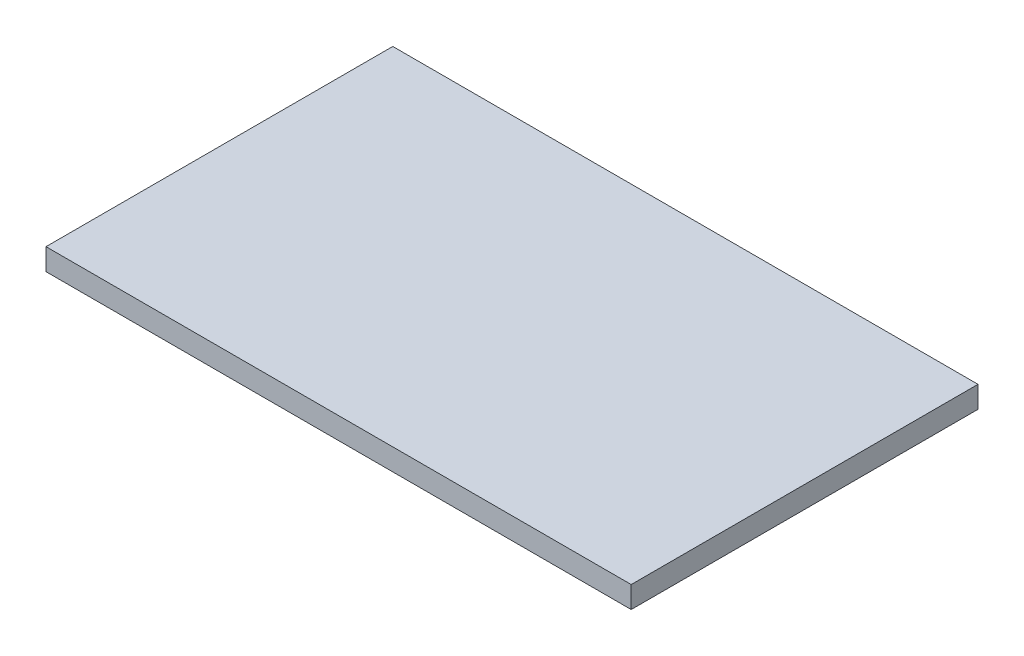
ISO-10303-21;
HEADER;
FILE_DESCRIPTION(('STEP AP214'),'2;1');
FILE_NAME('part.step','',(''),(''),'','','');
FILE_SCHEMA(('AUTOMOTIVE_DESIGN { 1 0 10303 214 1 1 1 1 }'));
ENDSEC;
DATA;
#1=APPLICATION_CONTEXT('core data for automotive mechanical design processes');
#2=APPLICATION_PROTOCOL_DEFINITION('international standard','automotive_design',2000,#1);
#3=PRODUCT_CONTEXT('',#1,'mechanical');
#4=PRODUCT('Part','Part','',(#3));
#5=PRODUCT_RELATED_PRODUCT_CATEGORY('part','',(#4));
#6=PRODUCT_DEFINITION_FORMATION('','',#4);
#7=PRODUCT_DEFINITION_CONTEXT('part definition',#1,'design');
#8=PRODUCT_DEFINITION('design','',#6,#7);
#9=PRODUCT_DEFINITION_SHAPE('','',#8);
#10=(LENGTH_UNIT() NAMED_UNIT(*) SI_UNIT(.MILLI.,.METRE.));
#11=(NAMED_UNIT(*) PLANE_ANGLE_UNIT() SI_UNIT($,.RADIAN.));
#12=(NAMED_UNIT(*) SI_UNIT($,.STERADIAN.) SOLID_ANGLE_UNIT());
#13=UNCERTAINTY_MEASURE_WITH_UNIT(LENGTH_MEASURE(1.E-05),#10,'distance_accuracy_value','');
#14=(GEOMETRIC_REPRESENTATION_CONTEXT(3) GLOBAL_UNCERTAINTY_ASSIGNED_CONTEXT((#13)) GLOBAL_UNIT_ASSIGNED_CONTEXT((#10,
#11,#12)) REPRESENTATION_CONTEXT('',''));
#15=CARTESIAN_POINT('',(0.,0.,0.));
#16=DIRECTION('',(0.,0.,1.));
#17=DIRECTION('',(1.,0.,0.));
#18=AXIS2_PLACEMENT_3D('',#15,#16,#17);
#19=CARTESIAN_POINT('',(135.,-5.,160.));
#20=DIRECTION('',(-1.,0.,0.));
#21=DIRECTION('',(0.,0.,1.));
#22=AXIS2_PLACEMENT_3D('',#19,#20,#21);
#23=PLANE('',#22);
#24=DIRECTION('',(0.,1.,0.));
#25=VECTOR('',#24,1.);
#26=CARTESIAN_POINT('',(135.,-5.,0.));
#27=LINE('',#26,#25);
#28=CARTESIAN_POINT('',(135.,-5.,0.));
#29=VERTEX_POINT('',#28);
#30=CARTESIAN_POINT('',(135.,5.,0.));
#31=VERTEX_POINT('',#30);
#32=EDGE_CURVE('E100',#29,#31,#27,.T.);
#33=ORIENTED_EDGE('',*,*,#32,.T.);
#34=DIRECTION('',(0.,0.,-1.));
#35=VECTOR('',#34,1.);
#36=CARTESIAN_POINT('',(135.,5.,160.));
#37=LINE('',#36,#35);
#38=CARTESIAN_POINT('',(135.,5.,160.));
#39=VERTEX_POINT('',#38);
#40=EDGE_CURVE('E11',#39,#31,#37,.T.);
#41=ORIENTED_EDGE('',*,*,#40,.F.);
#42=DIRECTION('',(0.,1.,0.));
#43=VECTOR('',#42,1.);
#44=CARTESIAN_POINT('',(135.,-5.,160.));
#45=LINE('',#44,#43);
#46=CARTESIAN_POINT('',(135.,-5.,160.));
#47=VERTEX_POINT('',#46);
#48=EDGE_CURVE('E88',#47,#39,#45,.T.);
#49=ORIENTED_EDGE('',*,*,#48,.F.);
#50=DIRECTION('',(0.,0.,-1.));
#51=VECTOR('',#50,1.);
#52=CARTESIAN_POINT('',(135.,-5.,160.));
#53=LINE('',#52,#51);
#54=EDGE_CURVE('E96',#47,#29,#53,.T.);
#55=ORIENTED_EDGE('',*,*,#54,.T.);
#56=EDGE_LOOP('',(#33,#41,#49,#55));
#57=FACE_BOUND('',#56,.T.);
#58=ADVANCED_FACE('F37',(#57),#23,.F.);
#59=CARTESIAN_POINT('',(-135.,5.,160.));
#60=DIRECTION('',(0.,-1.,0.));
#61=DIRECTION('',(0.,0.,-1.));
#62=AXIS2_PLACEMENT_3D('',#59,#60,#61);
#63=PLANE('',#62);
#64=DIRECTION('',(-1.,0.,0.));
#65=VECTOR('',#64,1.);
#66=CARTESIAN_POINT('',(-135.,5.,0.));
#67=LINE('',#66,#65);
#68=CARTESIAN_POINT('',(-135.,5.,0.));
#69=VERTEX_POINT('',#68);
#70=EDGE_CURVE('E92',#31,#69,#67,.T.);
#71=ORIENTED_EDGE('',*,*,#70,.T.);
#72=DIRECTION('',(0.,0.,-1.));
#73=VECTOR('',#72,1.);
#74=CARTESIAN_POINT('',(-135.,5.,160.));
#75=LINE('',#74,#73);
#76=CARTESIAN_POINT('',(-135.,5.,160.));
#77=VERTEX_POINT('',#76);
#78=EDGE_CURVE('E45',#77,#69,#75,.T.);
#79=ORIENTED_EDGE('',*,*,#78,.F.);
#80=DIRECTION('',(-1.,0.,0.));
#81=VECTOR('',#80,1.);
#82=CARTESIAN_POINT('',(-135.,5.,160.));
#83=LINE('',#82,#81);
#84=EDGE_CURVE('E83',#39,#77,#83,.T.);
#85=ORIENTED_EDGE('',*,*,#84,.F.);
#86=ORIENTED_EDGE('',*,*,#40,.T.);
#87=EDGE_LOOP('',(#71,#79,#85,#86));
#88=FACE_BOUND('',#87,.T.);
#89=ADVANCED_FACE('F91',(#88),#63,.F.);
#90=CARTESIAN_POINT('',(-135.,-5.,160.));
#91=DIRECTION('',(1.,0.,0.));
#92=DIRECTION('',(0.,0.,-1.));
#93=AXIS2_PLACEMENT_3D('',#90,#91,#92);
#94=PLANE('',#93);
#95=DIRECTION('',(0.,-1.,0.));
#96=VECTOR('',#95,1.);
#97=CARTESIAN_POINT('',(-135.,-5.,0.));
#98=LINE('',#97,#96);
#99=CARTESIAN_POINT('',(-135.,-5.,0.));
#100=VERTEX_POINT('',#99);
#101=EDGE_CURVE('E70',#69,#100,#98,.T.);
#102=ORIENTED_EDGE('',*,*,#101,.T.);
#103=DIRECTION('',(0.,0.,-1.));
#104=VECTOR('',#103,1.);
#105=CARTESIAN_POINT('',(-135.,-5.,160.));
#106=LINE('',#105,#104);
#107=CARTESIAN_POINT('',(-135.,-5.,160.));
#108=VERTEX_POINT('',#107);
#109=EDGE_CURVE('E93',#108,#100,#106,.T.);
#110=ORIENTED_EDGE('',*,*,#109,.F.);
#111=DIRECTION('',(0.,-1.,0.));
#112=VECTOR('',#111,1.);
#113=CARTESIAN_POINT('',(-135.,-5.,160.));
#114=LINE('',#113,#112);
#115=EDGE_CURVE('E86',#77,#108,#114,.T.);
#116=ORIENTED_EDGE('',*,*,#115,.F.);
#117=ORIENTED_EDGE('',*,*,#78,.T.);
#118=EDGE_LOOP('',(#102,#110,#116,#117));
#119=FACE_BOUND('',#118,.T.);
#120=ADVANCED_FACE('F94',(#119),#94,.F.);
#121=CARTESIAN_POINT('',(-135.,-5.,160.));
#122=DIRECTION('',(0.,1.,0.));
#123=DIRECTION('',(0.,0.,1.));
#124=AXIS2_PLACEMENT_3D('',#121,#122,#123);
#125=PLANE('',#124);
#126=DIRECTION('',(1.,0.,0.));
#127=VECTOR('',#126,1.);
#128=CARTESIAN_POINT('',(-135.,-5.,0.));
#129=LINE('',#128,#127);
#130=EDGE_CURVE('E76',#100,#29,#129,.T.);
#131=ORIENTED_EDGE('',*,*,#130,.T.);
#132=ORIENTED_EDGE('',*,*,#54,.F.);
#133=DIRECTION('',(1.,0.,0.));
#134=VECTOR('',#133,1.);
#135=CARTESIAN_POINT('',(-135.,-5.,160.));
#136=LINE('',#135,#134);
#137=EDGE_CURVE('E53',#108,#47,#136,.T.);
#138=ORIENTED_EDGE('',*,*,#137,.F.);
#139=ORIENTED_EDGE('',*,*,#109,.T.);
#140=EDGE_LOOP('',(#131,#132,#138,#139));
#141=FACE_BOUND('',#140,.T.);
#142=ADVANCED_FACE('F107',(#141),#125,.F.);
#143=CARTESIAN_POINT('',(0.,0.,160.));
#144=DIRECTION('',(0.,0.,-1.));
#145=DIRECTION('',(-1.,0.,0.));
#146=AXIS2_PLACEMENT_3D('',#143,#144,#145);
#147=PLANE('',#146);
#148=ORIENTED_EDGE('',*,*,#48,.T.);
#149=ORIENTED_EDGE('',*,*,#84,.T.);
#150=ORIENTED_EDGE('',*,*,#115,.T.);
#151=ORIENTED_EDGE('',*,*,#137,.T.);
#152=EDGE_LOOP('',(#148,#149,#150,#151));
#153=FACE_BOUND('',#152,.T.);
#154=ADVANCED_FACE('F84',(#153),#147,.F.);
#155=CARTESIAN_POINT('',(0.,0.,0.));
#156=DIRECTION('',(0.,0.,-1.));
#157=DIRECTION('',(-1.,0.,0.));
#158=AXIS2_PLACEMENT_3D('',#155,#156,#157);
#159=PLANE('',#158);
#160=ORIENTED_EDGE('',*,*,#32,.F.);
#161=ORIENTED_EDGE('',*,*,#130,.F.);
#162=ORIENTED_EDGE('',*,*,#101,.F.);
#163=ORIENTED_EDGE('',*,*,#70,.F.);
#164=EDGE_LOOP('',(#160,#161,#162,#163));
#165=FACE_BOUND('',#164,.T.);
#166=ADVANCED_FACE('F110',(#165),#159,.T.);
#167=CLOSED_SHELL('',(#58,#89,#120,#142,#154,#166));
#168=MANIFOLD_SOLID_BREP('B2',#167);
#169=ADVANCED_BREP_SHAPE_REPRESENTATION('',(#18,#168),#14);
#170=SHAPE_DEFINITION_REPRESENTATION(#9,#169);
ENDSEC;
END-ISO-10303-21;
